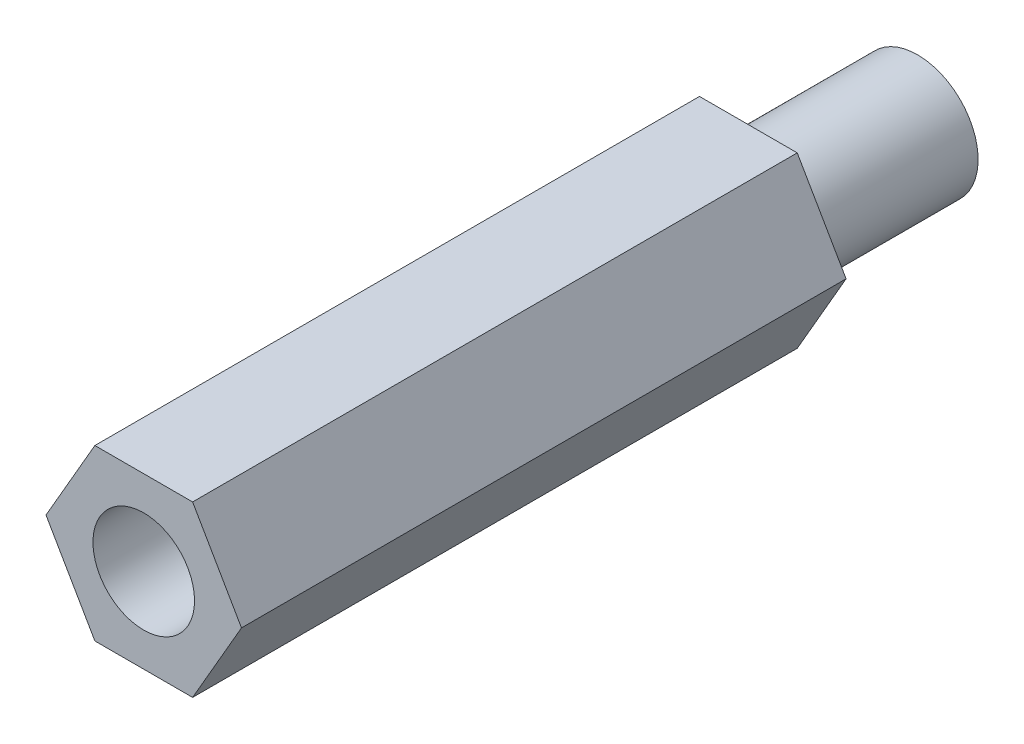
ISO-10303-21;
HEADER;
FILE_DESCRIPTION(('STEP AP214'),'2;1');
FILE_NAME('part.step','',(''),(''),'','','');
FILE_SCHEMA(('AUTOMOTIVE_DESIGN { 1 0 10303 214 1 1 1 1 }'));
ENDSEC;
DATA;
#1=APPLICATION_CONTEXT('core data for automotive mechanical design processes');
#2=APPLICATION_PROTOCOL_DEFINITION('international standard','automotive_design',2000,#1);
#3=PRODUCT_CONTEXT('',#1,'mechanical');
#4=PRODUCT('Part','Part','',(#3));
#5=PRODUCT_RELATED_PRODUCT_CATEGORY('part','',(#4));
#6=PRODUCT_DEFINITION_FORMATION('','',#4);
#7=PRODUCT_DEFINITION_CONTEXT('part definition',#1,'design');
#8=PRODUCT_DEFINITION('design','',#6,#7);
#9=PRODUCT_DEFINITION_SHAPE('','',#8);
#10=(LENGTH_UNIT() NAMED_UNIT(*) SI_UNIT(.MILLI.,.METRE.));
#11=(NAMED_UNIT(*) PLANE_ANGLE_UNIT() SI_UNIT($,.RADIAN.));
#12=(NAMED_UNIT(*) SI_UNIT($,.STERADIAN.) SOLID_ANGLE_UNIT());
#13=UNCERTAINTY_MEASURE_WITH_UNIT(LENGTH_MEASURE(1.E-05),#10,'distance_accuracy_value','');
#14=(GEOMETRIC_REPRESENTATION_CONTEXT(3) GLOBAL_UNCERTAINTY_ASSIGNED_CONTEXT((#13)) GLOBAL_UNIT_ASSIGNED_CONTEXT((#10,
#11,#12)) REPRESENTATION_CONTEXT('',''));
#15=CARTESIAN_POINT('',(0.,0.,0.));
#16=DIRECTION('',(0.,0.,1.));
#17=DIRECTION('',(1.,0.,0.));
#18=AXIS2_PLACEMENT_3D('',#15,#16,#17);
#19=CARTESIAN_POINT('',(2.02072594216369,3.5,25.));
#20=DIRECTION('',(0.,-1.,0.));
#21=DIRECTION('',(1.,0.,0.));
#22=AXIS2_PLACEMENT_3D('',#19,#20,#21);
#23=PLANE('',#22);
#24=DIRECTION('',(-1.,0.,0.));
#25=VECTOR('',#24,1.);
#26=CARTESIAN_POINT('',(2.02072594216369,3.5,0.));
#27=LINE('',#26,#25);
#28=CARTESIAN_POINT('',(2.02072594216369,3.5,0.));
#29=VERTEX_POINT('',#28);
#30=CARTESIAN_POINT('',(-2.02072594216369,3.5,0.));
#31=VERTEX_POINT('',#30);
#32=EDGE_CURVE('E124',#29,#31,#27,.T.);
#33=ORIENTED_EDGE('',*,*,#32,.T.);
#34=DIRECTION('',(0.,0.,-1.));
#35=VECTOR('',#34,1.);
#36=CARTESIAN_POINT('',(-2.02072594216369,3.5,25.));
#37=LINE('',#36,#35);
#38=CARTESIAN_POINT('',(-2.02072594216369,3.5,25.));
#39=VERTEX_POINT('',#38);
#40=EDGE_CURVE('E39',#39,#31,#37,.T.);
#41=ORIENTED_EDGE('',*,*,#40,.F.);
#42=DIRECTION('',(-1.,0.,0.));
#43=VECTOR('',#42,1.);
#44=CARTESIAN_POINT('',(2.02072594216369,3.5,25.));
#45=LINE('',#44,#43);
#46=CARTESIAN_POINT('',(2.02072594216369,3.5,25.));
#47=VERTEX_POINT('',#46);
#48=EDGE_CURVE('E135',#47,#39,#45,.T.);
#49=ORIENTED_EDGE('',*,*,#48,.F.);
#50=DIRECTION('',(0.,0.,-1.));
#51=VECTOR('',#50,1.);
#52=CARTESIAN_POINT('',(2.02072594216369,3.5,25.));
#53=LINE('',#52,#51);
#54=EDGE_CURVE('E120',#47,#29,#53,.T.);
#55=ORIENTED_EDGE('',*,*,#54,.T.);
#56=EDGE_LOOP('',(#33,#41,#49,#55));
#57=FACE_BOUND('',#56,.T.);
#58=ADVANCED_FACE('F36',(#57),#23,.F.);
#59=CARTESIAN_POINT('',(-2.02072594216369,3.5,25.));
#60=DIRECTION('',(0.866025403784439,-0.5,0.));
#61=DIRECTION('',(0.5,0.866025403784439,0.));
#62=AXIS2_PLACEMENT_3D('',#59,#60,#61);
#63=PLANE('',#62);
#64=DIRECTION('',(-0.5,-0.866025403784439,0.));
#65=VECTOR('',#64,1.);
#66=CARTESIAN_POINT('',(-2.02072594216369,3.5,0.));
#67=LINE('',#66,#65);
#68=CARTESIAN_POINT('',(-4.04145188432738,0.,0.));
#69=VERTEX_POINT('',#68);
#70=EDGE_CURVE('E127',#31,#69,#67,.T.);
#71=ORIENTED_EDGE('',*,*,#70,.T.);
#72=DIRECTION('',(0.,0.,-1.));
#73=VECTOR('',#72,1.);
#74=CARTESIAN_POINT('',(-4.04145188432738,0.,25.));
#75=LINE('',#74,#73);
#76=CARTESIAN_POINT('',(-4.04145188432738,0.,25.));
#77=VERTEX_POINT('',#76);
#78=EDGE_CURVE('E138',#77,#69,#75,.T.);
#79=ORIENTED_EDGE('',*,*,#78,.F.);
#80=DIRECTION('',(-0.5,-0.866025403784439,0.));
#81=VECTOR('',#80,1.);
#82=CARTESIAN_POINT('',(-2.02072594216369,3.5,25.));
#83=LINE('',#82,#81);
#84=EDGE_CURVE('E92',#39,#77,#83,.T.);
#85=ORIENTED_EDGE('',*,*,#84,.F.);
#86=ORIENTED_EDGE('',*,*,#40,.T.);
#87=EDGE_LOOP('',(#71,#79,#85,#86));
#88=FACE_BOUND('',#87,.T.);
#89=ADVANCED_FACE('F143',(#88),#63,.F.);
#90=CARTESIAN_POINT('',(-4.04145188432738,0.,25.));
#91=DIRECTION('',(0.866025403784438,0.5,0.));
#92=DIRECTION('',(-0.5,0.866025403784439,0.));
#93=AXIS2_PLACEMENT_3D('',#90,#91,#92);
#94=PLANE('',#93);
#95=DIRECTION('',(0.5,-0.866025403784439,0.));
#96=VECTOR('',#95,1.);
#97=CARTESIAN_POINT('',(-4.04145188432738,0.,0.));
#98=LINE('',#97,#96);
#99=CARTESIAN_POINT('',(-2.02072594216369,-3.5,0.));
#100=VERTEX_POINT('',#99);
#101=EDGE_CURVE('E130',#69,#100,#98,.T.);
#102=ORIENTED_EDGE('',*,*,#101,.T.);
#103=DIRECTION('',(0.,0.,-1.));
#104=VECTOR('',#103,1.);
#105=CARTESIAN_POINT('',(-2.02072594216369,-3.5,25.));
#106=LINE('',#105,#104);
#107=CARTESIAN_POINT('',(-2.02072594216369,-3.5,25.));
#108=VERTEX_POINT('',#107);
#109=EDGE_CURVE('E115',#108,#100,#106,.T.);
#110=ORIENTED_EDGE('',*,*,#109,.F.);
#111=DIRECTION('',(0.5,-0.866025403784439,0.));
#112=VECTOR('',#111,1.);
#113=CARTESIAN_POINT('',(-4.04145188432738,0.,25.));
#114=LINE('',#113,#112);
#115=EDGE_CURVE('E106',#77,#108,#114,.T.);
#116=ORIENTED_EDGE('',*,*,#115,.F.);
#117=ORIENTED_EDGE('',*,*,#78,.T.);
#118=EDGE_LOOP('',(#102,#110,#116,#117));
#119=FACE_BOUND('',#118,.T.);
#120=ADVANCED_FACE('F149',(#119),#94,.F.);
#121=CARTESIAN_POINT('',(-2.02072594216369,-3.5,25.));
#122=DIRECTION('',(0.,1.,0.));
#123=DIRECTION('',(-1.,0.,0.));
#124=AXIS2_PLACEMENT_3D('',#121,#122,#123);
#125=PLANE('',#124);
#126=DIRECTION('',(1.,0.,0.));
#127=VECTOR('',#126,1.);
#128=CARTESIAN_POINT('',(-2.02072594216369,-3.5,0.));
#129=LINE('',#128,#127);
#130=CARTESIAN_POINT('',(2.02072594216369,-3.5,0.));
#131=VERTEX_POINT('',#130);
#132=EDGE_CURVE('E114',#100,#131,#129,.T.);
#133=ORIENTED_EDGE('',*,*,#132,.T.);
#134=DIRECTION('',(0.,0.,-1.));
#135=VECTOR('',#134,1.);
#136=CARTESIAN_POINT('',(2.02072594216369,-3.5,25.));
#137=LINE('',#136,#135);
#138=CARTESIAN_POINT('',(2.02072594216369,-3.5,25.));
#139=VERTEX_POINT('',#138);
#140=EDGE_CURVE('E111',#139,#131,#137,.T.);
#141=ORIENTED_EDGE('',*,*,#140,.F.);
#142=DIRECTION('',(1.,0.,0.));
#143=VECTOR('',#142,1.);
#144=CARTESIAN_POINT('',(-2.02072594216369,-3.5,25.));
#145=LINE('',#144,#143);
#146=EDGE_CURVE('E100',#108,#139,#145,.T.);
#147=ORIENTED_EDGE('',*,*,#146,.F.);
#148=ORIENTED_EDGE('',*,*,#109,.T.);
#149=EDGE_LOOP('',(#133,#141,#147,#148));
#150=FACE_BOUND('',#149,.T.);
#151=ADVANCED_FACE('F112',(#150),#125,.F.);
#152=CARTESIAN_POINT('',(2.02072594216369,-3.5,25.));
#153=DIRECTION('',(-0.866025403784439,0.5,0.));
#154=DIRECTION('',(-0.5,-0.866025403784439,0.));
#155=AXIS2_PLACEMENT_3D('',#152,#153,#154);
#156=PLANE('',#155);
#157=DIRECTION('',(0.5,0.866025403784439,0.));
#158=VECTOR('',#157,1.);
#159=CARTESIAN_POINT('',(2.02072594216369,-3.5,0.));
#160=LINE('',#159,#158);
#161=CARTESIAN_POINT('',(4.04145188432738,0.,0.));
#162=VERTEX_POINT('',#161);
#163=EDGE_CURVE('E77',#131,#162,#160,.T.);
#164=ORIENTED_EDGE('',*,*,#163,.T.);
#165=DIRECTION('',(0.,0.,-1.));
#166=VECTOR('',#165,1.);
#167=CARTESIAN_POINT('',(4.04145188432738,0.,25.));
#168=LINE('',#167,#166);
#169=CARTESIAN_POINT('',(4.04145188432738,0.,25.));
#170=VERTEX_POINT('',#169);
#171=EDGE_CURVE('E116',#170,#162,#168,.T.);
#172=ORIENTED_EDGE('',*,*,#171,.F.);
#173=DIRECTION('',(0.5,0.866025403784439,0.));
#174=VECTOR('',#173,1.);
#175=CARTESIAN_POINT('',(2.02072594216369,-3.5,25.));
#176=LINE('',#175,#174);
#177=EDGE_CURVE('E104',#139,#170,#176,.T.);
#178=ORIENTED_EDGE('',*,*,#177,.F.);
#179=ORIENTED_EDGE('',*,*,#140,.T.);
#180=EDGE_LOOP('',(#164,#172,#178,#179));
#181=FACE_BOUND('',#180,.T.);
#182=ADVANCED_FACE('F118',(#181),#156,.F.);
#183=CARTESIAN_POINT('',(4.04145188432738,0.,25.));
#184=DIRECTION('',(-0.866025403784438,-0.5,0.));
#185=DIRECTION('',(0.5,-0.866025403784439,0.));
#186=AXIS2_PLACEMENT_3D('',#183,#184,#185);
#187=PLANE('',#186);
#188=DIRECTION('',(-0.5,0.866025403784438,0.));
#189=VECTOR('',#188,1.);
#190=CARTESIAN_POINT('',(4.04145188432738,0.,0.));
#191=LINE('',#190,#189);
#192=EDGE_CURVE('E83',#162,#29,#191,.T.);
#193=ORIENTED_EDGE('',*,*,#192,.T.);
#194=ORIENTED_EDGE('',*,*,#54,.F.);
#195=DIRECTION('',(-0.5,0.866025403784438,0.));
#196=VECTOR('',#195,1.);
#197=CARTESIAN_POINT('',(4.04145188432738,0.,25.));
#198=LINE('',#197,#196);
#199=EDGE_CURVE('E53',#170,#47,#198,.T.);
#200=ORIENTED_EDGE('',*,*,#199,.F.);
#201=ORIENTED_EDGE('',*,*,#171,.T.);
#202=EDGE_LOOP('',(#193,#194,#200,#201));
#203=FACE_BOUND('',#202,.T.);
#204=ADVANCED_FACE('F165',(#203),#187,.F.);
#205=CARTESIAN_POINT('',(0.,0.,25.));
#206=DIRECTION('',(0.,0.,1.));
#207=DIRECTION('',(1.,0.,0.));
#208=AXIS2_PLACEMENT_3D('',#205,#206,#207);
#209=PLANE('',#208);
#210=CARTESIAN_POINT('',(0.,0.,25.));
#211=DIRECTION('',(0.,0.,1.));
#212=DIRECTION('',(1.,0.,0.));
#213=AXIS2_PLACEMENT_3D('',#210,#211,#212);
#214=CIRCLE('',#213,2.1);
#215=CARTESIAN_POINT('',(2.1,0.,25.));
#216=VERTEX_POINT('',#215);
#217=EDGE_CURVE('E158',#216,#216,#214,.T.);
#218=ORIENTED_EDGE('',*,*,#217,.F.);
#219=EDGE_LOOP('',(#218));
#220=FACE_BOUND('',#219,.T.);
#221=ORIENTED_EDGE('',*,*,#48,.T.);
#222=ORIENTED_EDGE('',*,*,#84,.T.);
#223=ORIENTED_EDGE('',*,*,#115,.T.);
#224=ORIENTED_EDGE('',*,*,#146,.T.);
#225=ORIENTED_EDGE('',*,*,#177,.T.);
#226=ORIENTED_EDGE('',*,*,#199,.T.);
#227=EDGE_LOOP('',(#221,#222,#223,#224,#225,#226));
#228=FACE_BOUND('',#227,.T.);
#229=ADVANCED_FACE('F102',(#220,#228),#209,.T.);
#230=CARTESIAN_POINT('',(0.,0.,0.));
#231=DIRECTION('',(0.,0.,1.));
#232=DIRECTION('',(1.,0.,0.));
#233=AXIS2_PLACEMENT_3D('',#230,#231,#232);
#234=PLANE('',#233);
#235=CARTESIAN_POINT('',(0.,0.,0.));
#236=DIRECTION('',(0.,0.,-1.));
#237=DIRECTION('',(-1.,0.,0.));
#238=AXIS2_PLACEMENT_3D('',#235,#236,#237);
#239=CIRCLE('',#238,2.5);
#240=CARTESIAN_POINT('',(-2.5,0.,0.));
#241=VERTEX_POINT('',#240);
#242=EDGE_CURVE('E11',#241,#241,#239,.T.);
#243=ORIENTED_EDGE('',*,*,#242,.F.);
#244=EDGE_LOOP('',(#243));
#245=FACE_BOUND('',#244,.T.);
#246=ORIENTED_EDGE('',*,*,#32,.F.);
#247=ORIENTED_EDGE('',*,*,#192,.F.);
#248=ORIENTED_EDGE('',*,*,#163,.F.);
#249=ORIENTED_EDGE('',*,*,#132,.F.);
#250=ORIENTED_EDGE('',*,*,#101,.F.);
#251=ORIENTED_EDGE('',*,*,#70,.F.);
#252=EDGE_LOOP('',(#246,#247,#248,#249,#250,#251));
#253=FACE_BOUND('',#252,.T.);
#254=ADVANCED_FACE('F148',(#245,#253),#234,.F.);
#255=CARTESIAN_POINT('',(0.,0.,-7.));
#256=DIRECTION('',(0.,0.,1.));
#257=DIRECTION('',(1.,0.,0.));
#258=AXIS2_PLACEMENT_3D('',#255,#256,#257);
#259=CYLINDRICAL_SURFACE('',#258,2.5);
#260=CARTESIAN_POINT('',(0.,0.,-7.));
#261=DIRECTION('',(0.,0.,-1.));
#262=DIRECTION('',(-1.,0.,0.));
#263=AXIS2_PLACEMENT_3D('',#260,#261,#262);
#264=CIRCLE('',#263,2.5);
#265=CARTESIAN_POINT('',(-2.5,0.,-7.));
#266=VERTEX_POINT('',#265);
#267=EDGE_CURVE('E128',#266,#266,#264,.T.);
#268=ORIENTED_EDGE('',*,*,#267,.F.);
#269=EDGE_LOOP('',(#268));
#270=FACE_BOUND('',#269,.T.);
#271=ORIENTED_EDGE('',*,*,#242,.T.);
#272=EDGE_LOOP('',(#271));
#273=FACE_BOUND('',#272,.T.);
#274=ADVANCED_FACE('F171',(#270,#273),#259,.T.);
#275=CARTESIAN_POINT('',(0.,0.,-7.));
#276=DIRECTION('',(0.,0.,-1.));
#277=DIRECTION('',(-1.,0.,0.));
#278=AXIS2_PLACEMENT_3D('',#275,#276,#277);
#279=PLANE('',#278);
#280=ORIENTED_EDGE('',*,*,#267,.T.);
#281=EDGE_LOOP('',(#280));
#282=FACE_BOUND('',#281,.T.);
#283=ADVANCED_FACE('F212',(#282),#279,.T.);
#284=CARTESIAN_POINT('',(0.,0.,11.));
#285=DIRECTION('',(0.,0.,1.));
#286=DIRECTION('',(1.,0.,0.));
#287=AXIS2_PLACEMENT_3D('',#284,#285,#286);
#288=CONICAL_SURFACE('',#287,2.1,1.02974425867665);
#289=CARTESIAN_POINT('',(0.,0.,9.73819270004213));
#290=VERTEX_POINT('',#289);
#291=VERTEX_LOOP('',#290);
#292=FACE_BOUND('',#291,.T.);
#293=CARTESIAN_POINT('',(0.,0.,11.));
#294=DIRECTION('',(0.,0.,1.));
#295=DIRECTION('',(1.,0.,0.));
#296=AXIS2_PLACEMENT_3D('',#293,#294,#295);
#297=CIRCLE('',#296,2.1);
#298=CARTESIAN_POINT('',(2.1,0.,11.));
#299=VERTEX_POINT('',#298);
#300=EDGE_CURVE('E155',#299,#299,#297,.T.);
#301=ORIENTED_EDGE('',*,*,#300,.T.);
#302=EDGE_LOOP('',(#301));
#303=FACE_BOUND('',#302,.T.);
#304=ADVANCED_FACE('F220',(#292,#303),#288,.F.);
#305=CARTESIAN_POINT('',(0.,0.,25.));
#306=DIRECTION('',(0.,0.,1.));
#307=DIRECTION('',(1.,0.,0.));
#308=AXIS2_PLACEMENT_3D('',#305,#306,#307);
#309=CYLINDRICAL_SURFACE('',#308,2.1);
#310=ORIENTED_EDGE('',*,*,#300,.F.);
#311=EDGE_LOOP('',(#310));
#312=FACE_BOUND('',#311,.T.);
#313=ORIENTED_EDGE('',*,*,#217,.T.);
#314=EDGE_LOOP('',(#313));
#315=FACE_BOUND('',#314,.T.);
#316=ADVANCED_FACE('F162',(#312,#315),#309,.F.);
#317=CLOSED_SHELL('',(#58,#89,#120,#151,#182,#204,#229,#254,#274,#283,#304,#316));
#318=MANIFOLD_SOLID_BREP('B2',#317);
#319=ADVANCED_BREP_SHAPE_REPRESENTATION('',(#18,#318),#14);
#320=SHAPE_DEFINITION_REPRESENTATION(#9,#319);
ENDSEC;
END-ISO-10303-21;
